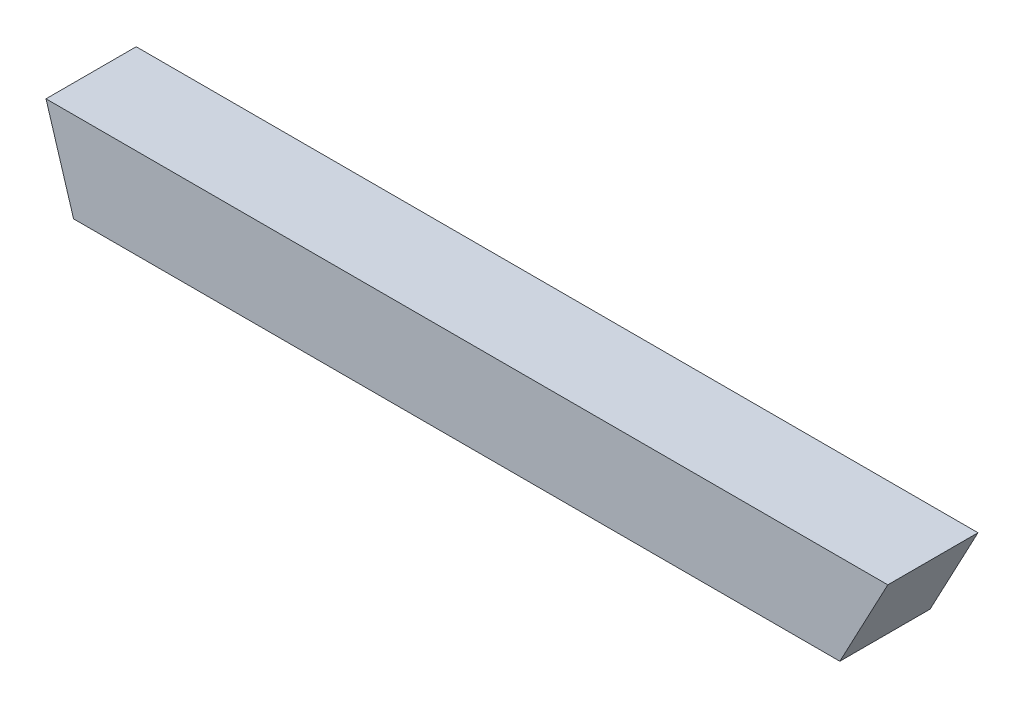
ISO-10303-21;
HEADER;
FILE_DESCRIPTION(('STEP AP214'),'2;1');
FILE_NAME('part.step','',(''),(''),'','','');
FILE_SCHEMA(('AUTOMOTIVE_DESIGN { 1 0 10303 214 1 1 1 1 }'));
ENDSEC;
DATA;
#1=APPLICATION_CONTEXT('core data for automotive mechanical design processes');
#2=APPLICATION_PROTOCOL_DEFINITION('international standard','automotive_design',2000,#1);
#3=PRODUCT_CONTEXT('',#1,'mechanical');
#4=PRODUCT('Part','Part','',(#3));
#5=PRODUCT_RELATED_PRODUCT_CATEGORY('part','',(#4));
#6=PRODUCT_DEFINITION_FORMATION('','',#4);
#7=PRODUCT_DEFINITION_CONTEXT('part definition',#1,'design');
#8=PRODUCT_DEFINITION('design','',#6,#7);
#9=PRODUCT_DEFINITION_SHAPE('','',#8);
#10=(LENGTH_UNIT() NAMED_UNIT(*) SI_UNIT(.MILLI.,.METRE.));
#11=(NAMED_UNIT(*) PLANE_ANGLE_UNIT() SI_UNIT($,.RADIAN.));
#12=(NAMED_UNIT(*) SI_UNIT($,.STERADIAN.) SOLID_ANGLE_UNIT());
#13=UNCERTAINTY_MEASURE_WITH_UNIT(LENGTH_MEASURE(1.E-05),#10,'distance_accuracy_value','');
#14=(GEOMETRIC_REPRESENTATION_CONTEXT(3) GLOBAL_UNCERTAINTY_ASSIGNED_CONTEXT((#13)) GLOBAL_UNIT_ASSIGNED_CONTEXT((#10,
#11,#12)) REPRESENTATION_CONTEXT('',''));
#15=CARTESIAN_POINT('',(0.,0.,0.));
#16=DIRECTION('',(0.,0.,1.));
#17=DIRECTION('',(1.,0.,0.));
#18=AXIS2_PLACEMENT_3D('',#15,#16,#17);
#19=CARTESIAN_POINT('',(-42.0748246622608,-12.8635648162469,19.05));
#20=DIRECTION('',(0.956304755963034,0.292371704722742,0.));
#21=DIRECTION('',(-0.292371704722742,0.956304755963034,0.));
#22=AXIS2_PLACEMENT_3D('',#19,#20,#21);
#23=PLANE('',#22);
#24=DIRECTION('',(0.292371704722742,-0.956304755963034,0.));
#25=VECTOR('',#24,1.);
#26=CARTESIAN_POINT('',(-42.0748246622608,-12.8635648162469,0.));
#27=LINE('',#26,#25);
#28=CARTESIAN_POINT('',(-51.8317805813072,19.05,0.));
#29=VERTEX_POINT('',#28);
#30=CARTESIAN_POINT('',(-46.0076110995197,0.,0.));
#31=VERTEX_POINT('',#30);
#32=EDGE_CURVE('E98',#29,#31,#27,.T.);
#33=ORIENTED_EDGE('',*,*,#32,.T.);
#34=DIRECTION('',(0.,0.,-1.));
#35=VECTOR('',#34,1.);
#36=CARTESIAN_POINT('',(-46.0076110995197,0.,19.05));
#37=LINE('',#36,#35);
#38=CARTESIAN_POINT('',(-46.0076110995197,0.,19.05));
#39=VERTEX_POINT('',#38);
#40=EDGE_CURVE('E11',#39,#31,#37,.T.);
#41=ORIENTED_EDGE('',*,*,#40,.F.);
#42=DIRECTION('',(0.292371704722742,-0.956304755963034,0.));
#43=VECTOR('',#42,1.);
#44=CARTESIAN_POINT('',(-42.0748246622608,-12.8635648162469,19.05));
#45=LINE('',#44,#43);
#46=CARTESIAN_POINT('',(-51.8317805813072,19.05,19.05));
#47=VERTEX_POINT('',#46);
#48=EDGE_CURVE('E86',#47,#39,#45,.T.);
#49=ORIENTED_EDGE('',*,*,#48,.F.);
#50=DIRECTION('',(0.,0.,-1.));
#51=VECTOR('',#50,1.);
#52=CARTESIAN_POINT('',(-51.8317805813072,19.05,19.05));
#53=LINE('',#52,#51);
#54=EDGE_CURVE('E94',#47,#29,#53,.T.);
#55=ORIENTED_EDGE('',*,*,#54,.T.);
#56=EDGE_LOOP('',(#33,#41,#49,#55));
#57=FACE_BOUND('',#56,.T.);
#58=ADVANCED_FACE('F35',(#57),#23,.F.);
#59=CARTESIAN_POINT('',(0.,0.,19.05));
#60=DIRECTION('',(0.,1.,0.));
#61=DIRECTION('',(-1.,0.,0.));
#62=AXIS2_PLACEMENT_3D('',#59,#60,#61);
#63=PLANE('',#62);
#64=DIRECTION('',(1.,0.,0.));
#65=VECTOR('',#64,1.);
#66=CARTESIAN_POINT('',(0.,0.,0.));
#67=LINE('',#66,#65);
#68=CARTESIAN_POINT('',(115.839154745541,0.,0.));
#69=VERTEX_POINT('',#68);
#70=EDGE_CURVE('E90',#31,#69,#67,.T.);
#71=ORIENTED_EDGE('',*,*,#70,.T.);
#72=DIRECTION('',(0.,0.,-1.));
#73=VECTOR('',#72,1.);
#74=CARTESIAN_POINT('',(115.839154745541,0.,19.05));
#75=LINE('',#74,#73);
#76=CARTESIAN_POINT('',(115.839154745541,0.,19.05));
#77=VERTEX_POINT('',#76);
#78=EDGE_CURVE('E43',#77,#69,#75,.T.);
#79=ORIENTED_EDGE('',*,*,#78,.F.);
#80=DIRECTION('',(1.,0.,0.));
#81=VECTOR('',#80,1.);
#82=CARTESIAN_POINT('',(0.,0.,19.05));
#83=LINE('',#82,#81);
#84=EDGE_CURVE('E81',#39,#77,#83,.T.);
#85=ORIENTED_EDGE('',*,*,#84,.F.);
#86=ORIENTED_EDGE('',*,*,#40,.T.);
#87=EDGE_LOOP('',(#71,#79,#85,#86));
#88=FACE_BOUND('',#87,.T.);
#89=ADVANCED_FACE('F89',(#88),#63,.F.);
#90=CARTESIAN_POINT('',(90.3077940116485,-48.0175058285361,19.05));
#91=DIRECTION('',(-0.882947592858925,0.469471562785895,0.));
#92=DIRECTION('',(-0.469471562785895,-0.882947592858925,0.));
#93=AXIS2_PLACEMENT_3D('',#90,#91,#92);
#94=PLANE('',#93);
#95=DIRECTION('',(0.469471562785895,0.882947592858925,0.));
#96=VECTOR('',#95,1.);
#97=CARTESIAN_POINT('',(90.3077940116485,-48.0175058285361,0.));
#98=LINE('',#97,#96);
#99=CARTESIAN_POINT('',(125.968219418693,19.05,0.));
#100=VERTEX_POINT('',#99);
#101=EDGE_CURVE('E68',#69,#100,#98,.T.);
#102=ORIENTED_EDGE('',*,*,#101,.T.);
#103=DIRECTION('',(0.,0.,-1.));
#104=VECTOR('',#103,1.);
#105=CARTESIAN_POINT('',(125.968219418693,19.05,19.05));
#106=LINE('',#105,#104);
#107=CARTESIAN_POINT('',(125.968219418693,19.05,19.05));
#108=VERTEX_POINT('',#107);
#109=EDGE_CURVE('E91',#108,#100,#106,.T.);
#110=ORIENTED_EDGE('',*,*,#109,.F.);
#111=DIRECTION('',(0.469471562785895,0.882947592858925,0.));
#112=VECTOR('',#111,1.);
#113=CARTESIAN_POINT('',(90.3077940116485,-48.0175058285361,19.05));
#114=LINE('',#113,#112);
#115=EDGE_CURVE('E84',#77,#108,#114,.T.);
#116=ORIENTED_EDGE('',*,*,#115,.F.);
#117=ORIENTED_EDGE('',*,*,#78,.T.);
#118=EDGE_LOOP('',(#102,#110,#116,#117));
#119=FACE_BOUND('',#118,.T.);
#120=ADVANCED_FACE('F92',(#119),#94,.F.);
#121=CARTESIAN_POINT('',(0.,19.05,19.05));
#122=DIRECTION('',(0.,-1.,0.));
#123=DIRECTION('',(1.,0.,0.));
#124=AXIS2_PLACEMENT_3D('',#121,#122,#123);
#125=PLANE('',#124);
#126=DIRECTION('',(-1.,0.,0.));
#127=VECTOR('',#126,1.);
#128=CARTESIAN_POINT('',(0.,19.05,0.));
#129=LINE('',#128,#127);
#130=EDGE_CURVE('E74',#100,#29,#129,.T.);
#131=ORIENTED_EDGE('',*,*,#130,.T.);
#132=ORIENTED_EDGE('',*,*,#54,.F.);
#133=DIRECTION('',(-1.,0.,0.));
#134=VECTOR('',#133,1.);
#135=CARTESIAN_POINT('',(0.,19.05,19.05));
#136=LINE('',#135,#134);
#137=EDGE_CURVE('E51',#108,#47,#136,.T.);
#138=ORIENTED_EDGE('',*,*,#137,.F.);
#139=ORIENTED_EDGE('',*,*,#109,.T.);
#140=EDGE_LOOP('',(#131,#132,#138,#139));
#141=FACE_BOUND('',#140,.T.);
#142=ADVANCED_FACE('F105',(#141),#125,.F.);
#143=CARTESIAN_POINT('',(0.,0.,19.05));
#144=DIRECTION('',(0.,0.,1.));
#145=DIRECTION('',(1.,0.,0.));
#146=AXIS2_PLACEMENT_3D('',#143,#144,#145);
#147=PLANE('',#146);
#148=ORIENTED_EDGE('',*,*,#48,.T.);
#149=ORIENTED_EDGE('',*,*,#84,.T.);
#150=ORIENTED_EDGE('',*,*,#115,.T.);
#151=ORIENTED_EDGE('',*,*,#137,.T.);
#152=EDGE_LOOP('',(#148,#149,#150,#151));
#153=FACE_BOUND('',#152,.T.);
#154=ADVANCED_FACE('F82',(#153),#147,.T.);
#155=CARTESIAN_POINT('',(0.,0.,0.));
#156=DIRECTION('',(0.,0.,1.));
#157=DIRECTION('',(1.,0.,0.));
#158=AXIS2_PLACEMENT_3D('',#155,#156,#157);
#159=PLANE('',#158);
#160=ORIENTED_EDGE('',*,*,#32,.F.);
#161=ORIENTED_EDGE('',*,*,#130,.F.);
#162=ORIENTED_EDGE('',*,*,#101,.F.);
#163=ORIENTED_EDGE('',*,*,#70,.F.);
#164=EDGE_LOOP('',(#160,#161,#162,#163));
#165=FACE_BOUND('',#164,.T.);
#166=ADVANCED_FACE('F108',(#165),#159,.F.);
#167=CLOSED_SHELL('',(#58,#89,#120,#142,#154,#166));
#168=MANIFOLD_SOLID_BREP('B2',#167);
#169=ADVANCED_BREP_SHAPE_REPRESENTATION('',(#18,#168),#14);
#170=SHAPE_DEFINITION_REPRESENTATION(#9,#169);
ENDSEC;
END-ISO-10303-21;
